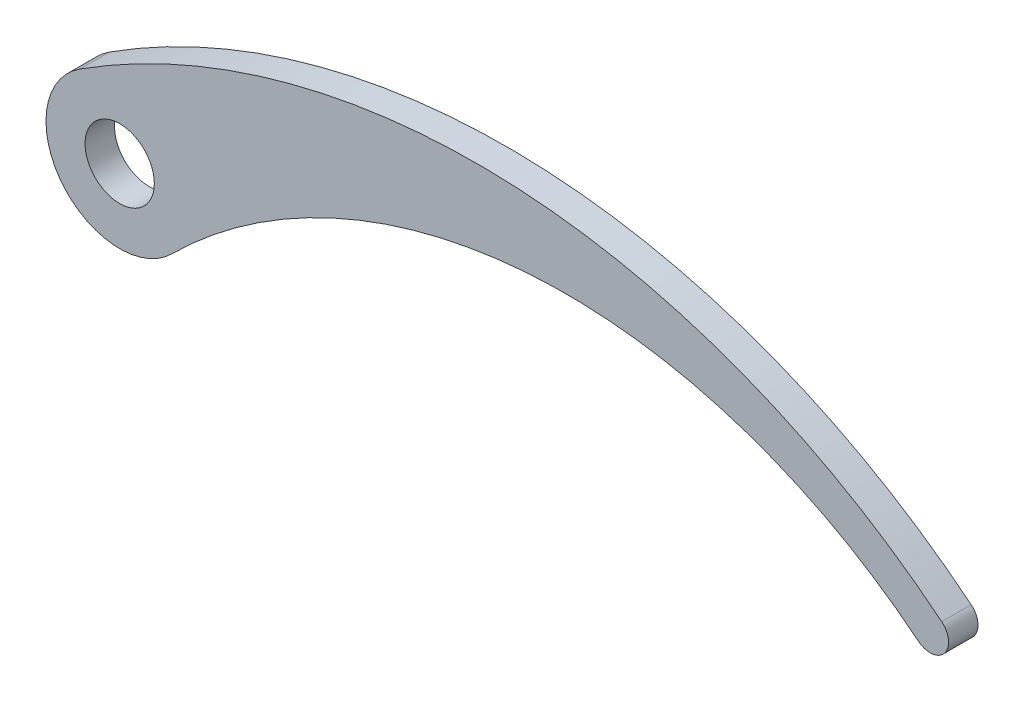
ISO-10303-21;
HEADER;
FILE_DESCRIPTION(('STEP AP214'),'2;1');
FILE_NAME('part.step','',(''),(''),'','','');
FILE_SCHEMA(('AUTOMOTIVE_DESIGN { 1 0 10303 214 1 1 1 1 }'));
ENDSEC;
DATA;
#1=APPLICATION_CONTEXT('core data for automotive mechanical design processes');
#2=APPLICATION_PROTOCOL_DEFINITION('international standard','automotive_design',2000,#1);
#3=PRODUCT_CONTEXT('',#1,'mechanical');
#4=PRODUCT('Part','Part','',(#3));
#5=PRODUCT_RELATED_PRODUCT_CATEGORY('part','',(#4));
#6=PRODUCT_DEFINITION_FORMATION('','',#4);
#7=PRODUCT_DEFINITION_CONTEXT('part definition',#1,'design');
#8=PRODUCT_DEFINITION('design','',#6,#7);
#9=PRODUCT_DEFINITION_SHAPE('','',#8);
#10=(LENGTH_UNIT() NAMED_UNIT(*) SI_UNIT(.MILLI.,.METRE.));
#11=(NAMED_UNIT(*) PLANE_ANGLE_UNIT() SI_UNIT($,.RADIAN.));
#12=(NAMED_UNIT(*) SI_UNIT($,.STERADIAN.) SOLID_ANGLE_UNIT());
#13=UNCERTAINTY_MEASURE_WITH_UNIT(LENGTH_MEASURE(1.E-05),#10,'distance_accuracy_value','');
#14=(GEOMETRIC_REPRESENTATION_CONTEXT(3) GLOBAL_UNCERTAINTY_ASSIGNED_CONTEXT((#13)) GLOBAL_UNIT_ASSIGNED_CONTEXT((#10,
#11,#12)) REPRESENTATION_CONTEXT('',''));
#15=CARTESIAN_POINT('',(0.,0.,0.));
#16=DIRECTION('',(0.,0.,1.));
#17=DIRECTION('',(1.,0.,0.));
#18=AXIS2_PLACEMENT_3D('',#15,#16,#17);
#19=CARTESIAN_POINT('',(39.6519886363636,-18.9361868437573,2.));
#20=DIRECTION('',(0.,0.,-1.));
#21=DIRECTION('',(-1.,0.,0.));
#22=AXIS2_PLACEMENT_3D('',#19,#20,#21);
#23=PLANE('',#22);
#24=CARTESIAN_POINT('',(24.3039772727273,-37.8723736875147,2.));
#25=DIRECTION('',(0.,0.,1.));
#26=DIRECTION('',(-1.,0.,0.));
#27=AXIS2_PLACEMENT_3D('',#24,#25,#26);
#28=CIRCLE('',#27,50.);
#29=CARTESIAN_POINT('',(55.7870775058275,0.971086504808066,2.));
#30=VERTEX_POINT('',#29);
#31=CARTESIAN_POINT('',(-2.70044191919192,4.20804152083496,2.));
#32=VERTEX_POINT('',#31);
#33=EDGE_CURVE('E92',#30,#32,#28,.T.);
#34=ORIENTED_EDGE('',*,*,#33,.T.);
#35=CARTESIAN_POINT('',(0.,0.,2.));
#36=DIRECTION('',(0.,0.,1.));
#37=DIRECTION('',(1.,0.,0.));
#38=AXIS2_PLACEMENT_3D('',#35,#36,#37);
#39=CIRCLE('',#38,5.);
#40=CARTESIAN_POINT('',(3.52371828752642,-3.54731016830384,2.));
#41=VERTEX_POINT('',#40);
#42=EDGE_CURVE('E87',#32,#41,#39,.T.);
#43=ORIENTED_EDGE('',*,*,#42,.T.);
#44=CARTESIAN_POINT('',(30.3039772727273,-30.506867447413,2.));
#45=DIRECTION('',(0.,0.,-1.));
#46=DIRECTION('',(-1.,0.,0.));
#47=AXIS2_PLACEMENT_3D('',#44,#45,#46);
#48=CIRCLE('',#47,38.);
#49=CARTESIAN_POINT('',(54.2135024609149,-0.971556288134171,2.));
#50=VERTEX_POINT('',#49);
#51=EDGE_CURVE('E90',#41,#50,#48,.T.);
#52=ORIENTED_EDGE('',*,*,#51,.T.);
#53=CARTESIAN_POINT('',(55.,0.,2.));
#54=DIRECTION('',(0.,0.,1.));
#55=DIRECTION('',(1.,0.,0.));
#56=AXIS2_PLACEMENT_3D('',#53,#54,#55);
#57=CIRCLE('',#56,1.25);
#58=EDGE_CURVE('E57',#50,#30,#57,.T.);
#59=ORIENTED_EDGE('',*,*,#58,.T.);
#60=EDGE_LOOP('',(#34,#43,#52,#59));
#61=FACE_BOUND('',#60,.T.);
#62=CARTESIAN_POINT('',(0.,0.,2.));
#63=DIRECTION('',(0.,0.,1.));
#64=DIRECTION('',(1.,0.,0.));
#65=AXIS2_PLACEMENT_3D('',#62,#63,#64);
#66=CIRCLE('',#65,2.35);
#67=CARTESIAN_POINT('',(2.35,0.,2.));
#68=VERTEX_POINT('',#67);
#69=EDGE_CURVE('E112',#68,#68,#66,.T.);
#70=ORIENTED_EDGE('',*,*,#69,.F.);
#71=EDGE_LOOP('',(#70));
#72=FACE_BOUND('',#71,.T.);
#73=ADVANCED_FACE('F39',(#61,#72),#23,.F.);
#74=CARTESIAN_POINT('',(39.6519886363636,-18.9361868437573,0.));
#75=DIRECTION('',(0.,0.,-1.));
#76=DIRECTION('',(-1.,0.,0.));
#77=AXIS2_PLACEMENT_3D('',#74,#75,#76);
#78=PLANE('',#77);
#79=CARTESIAN_POINT('',(24.3039772727273,-37.8723736875147,0.));
#80=DIRECTION('',(0.,0.,1.));
#81=DIRECTION('',(-1.,0.,0.));
#82=AXIS2_PLACEMENT_3D('',#79,#80,#81);
#83=CIRCLE('',#82,50.);
#84=CARTESIAN_POINT('',(55.7870775058275,0.971086504808066,0.));
#85=VERTEX_POINT('',#84);
#86=CARTESIAN_POINT('',(-2.70044191919192,4.20804152083496,0.));
#87=VERTEX_POINT('',#86);
#88=EDGE_CURVE('E108',#85,#87,#83,.T.);
#89=ORIENTED_EDGE('',*,*,#88,.F.);
#90=CARTESIAN_POINT('',(55.,0.,0.));
#91=DIRECTION('',(0.,0.,1.));
#92=DIRECTION('',(1.,0.,0.));
#93=AXIS2_PLACEMENT_3D('',#90,#91,#92);
#94=CIRCLE('',#93,1.25);
#95=CARTESIAN_POINT('',(54.2135024609149,-0.971556288134171,0.));
#96=VERTEX_POINT('',#95);
#97=EDGE_CURVE('E80',#96,#85,#94,.T.);
#98=ORIENTED_EDGE('',*,*,#97,.F.);
#99=CARTESIAN_POINT('',(30.3039772727273,-30.506867447413,0.));
#100=DIRECTION('',(0.,0.,-1.));
#101=DIRECTION('',(-1.,0.,0.));
#102=AXIS2_PLACEMENT_3D('',#99,#100,#101);
#103=CIRCLE('',#102,38.);
#104=CARTESIAN_POINT('',(3.52371828752642,-3.54731016830384,0.));
#105=VERTEX_POINT('',#104);
#106=EDGE_CURVE('E74',#105,#96,#103,.T.);
#107=ORIENTED_EDGE('',*,*,#106,.F.);
#108=CARTESIAN_POINT('',(0.,0.,0.));
#109=DIRECTION('',(0.,0.,1.));
#110=DIRECTION('',(1.,0.,0.));
#111=AXIS2_PLACEMENT_3D('',#108,#109,#110);
#112=CIRCLE('',#111,5.);
#113=EDGE_CURVE('E97',#87,#105,#112,.T.);
#114=ORIENTED_EDGE('',*,*,#113,.F.);
#115=EDGE_LOOP('',(#89,#98,#107,#114));
#116=FACE_BOUND('',#115,.T.);
#117=CARTESIAN_POINT('',(0.,0.,0.));
#118=DIRECTION('',(0.,0.,1.));
#119=DIRECTION('',(1.,0.,0.));
#120=AXIS2_PLACEMENT_3D('',#117,#118,#119);
#121=CIRCLE('',#120,2.35);
#122=CARTESIAN_POINT('',(2.35,0.,0.));
#123=VERTEX_POINT('',#122);
#124=EDGE_CURVE('E130',#123,#123,#121,.T.);
#125=ORIENTED_EDGE('',*,*,#124,.T.);
#126=EDGE_LOOP('',(#125));
#127=FACE_BOUND('',#126,.T.);
#128=ADVANCED_FACE('F125',(#116,#127),#78,.T.);
#129=CARTESIAN_POINT('',(24.3039772727273,-37.8723736875147,2.));
#130=DIRECTION('',(0.,0.,-1.));
#131=DIRECTION('',(-1.,0.,0.));
#132=AXIS2_PLACEMENT_3D('',#129,#130,#131);
#133=CYLINDRICAL_SURFACE('',#132,50.);
#134=ORIENTED_EDGE('',*,*,#88,.T.);
#135=DIRECTION('',(0.,0.,-1.));
#136=VECTOR('',#135,1.);
#137=CARTESIAN_POINT('',(-2.70044191919192,4.20804152083496,2.));
#138=LINE('',#137,#136);
#139=EDGE_CURVE('E11',#32,#87,#138,.T.);
#140=ORIENTED_EDGE('',*,*,#139,.F.);
#141=ORIENTED_EDGE('',*,*,#33,.F.);
#142=DIRECTION('',(0.,0.,-1.));
#143=VECTOR('',#142,1.);
#144=CARTESIAN_POINT('',(55.7870775058275,0.971086504808066,2.));
#145=LINE('',#144,#143);
#146=EDGE_CURVE('E104',#30,#85,#145,.T.);
#147=ORIENTED_EDGE('',*,*,#146,.T.);
#148=EDGE_LOOP('',(#134,#140,#141,#147));
#149=FACE_BOUND('',#148,.T.);
#150=ADVANCED_FACE('F41',(#149),#133,.T.);
#151=CARTESIAN_POINT('',(0.,0.,2.));
#152=DIRECTION('',(0.,0.,-1.));
#153=DIRECTION('',(-1.,0.,0.));
#154=AXIS2_PLACEMENT_3D('',#151,#152,#153);
#155=CYLINDRICAL_SURFACE('',#154,5.);
#156=ORIENTED_EDGE('',*,*,#113,.T.);
#157=DIRECTION('',(0.,0.,-1.));
#158=VECTOR('',#157,1.);
#159=CARTESIAN_POINT('',(3.52371828752642,-3.54731016830384,2.));
#160=LINE('',#159,#158);
#161=EDGE_CURVE('E49',#41,#105,#160,.T.);
#162=ORIENTED_EDGE('',*,*,#161,.F.);
#163=ORIENTED_EDGE('',*,*,#42,.F.);
#164=ORIENTED_EDGE('',*,*,#139,.T.);
#165=EDGE_LOOP('',(#156,#162,#163,#164));
#166=FACE_BOUND('',#165,.T.);
#167=ADVANCED_FACE('F96',(#166),#155,.T.);
#168=CARTESIAN_POINT('',(30.3039772727273,-30.506867447413,2.));
#169=DIRECTION('',(0.,0.,-1.));
#170=DIRECTION('',(-1.,0.,0.));
#171=AXIS2_PLACEMENT_3D('',#168,#169,#170);
#172=CYLINDRICAL_SURFACE('',#171,38.);
#173=ORIENTED_EDGE('',*,*,#106,.T.);
#174=DIRECTION('',(0.,0.,-1.));
#175=VECTOR('',#174,1.);
#176=CARTESIAN_POINT('',(54.2135024609149,-0.971556288134171,2.));
#177=LINE('',#176,#175);
#178=EDGE_CURVE('E99',#50,#96,#177,.T.);
#179=ORIENTED_EDGE('',*,*,#178,.F.);
#180=ORIENTED_EDGE('',*,*,#51,.F.);
#181=ORIENTED_EDGE('',*,*,#161,.T.);
#182=EDGE_LOOP('',(#173,#179,#180,#181));
#183=FACE_BOUND('',#182,.T.);
#184=ADVANCED_FACE('F100',(#183),#172,.F.);
#185=CARTESIAN_POINT('',(55.,0.,2.));
#186=DIRECTION('',(0.,0.,-1.));
#187=DIRECTION('',(-1.,0.,0.));
#188=AXIS2_PLACEMENT_3D('',#185,#186,#187);
#189=CYLINDRICAL_SURFACE('',#188,1.25);
#190=ORIENTED_EDGE('',*,*,#97,.T.);
#191=ORIENTED_EDGE('',*,*,#146,.F.);
#192=ORIENTED_EDGE('',*,*,#58,.F.);
#193=ORIENTED_EDGE('',*,*,#178,.T.);
#194=EDGE_LOOP('',(#190,#191,#192,#193));
#195=FACE_BOUND('',#194,.T.);
#196=ADVANCED_FACE('F122',(#195),#189,.T.);
#197=CARTESIAN_POINT('',(0.,0.,2.));
#198=DIRECTION('',(0.,0.,-1.));
#199=DIRECTION('',(-1.,0.,0.));
#200=AXIS2_PLACEMENT_3D('',#197,#198,#199);
#201=CYLINDRICAL_SURFACE('',#200,2.35);
#202=ORIENTED_EDGE('',*,*,#69,.T.);
#203=EDGE_LOOP('',(#202));
#204=FACE_BOUND('',#203,.T.);
#205=ORIENTED_EDGE('',*,*,#124,.F.);
#206=EDGE_LOOP('',(#205));
#207=FACE_BOUND('',#206,.T.);
#208=ADVANCED_FACE('F138',(#204,#207),#201,.F.);
#209=CLOSED_SHELL('',(#73,#128,#150,#167,#184,#196,#208));
#210=MANIFOLD_SOLID_BREP('B2',#209);
#211=ADVANCED_BREP_SHAPE_REPRESENTATION('',(#18,#210),#14);
#212=SHAPE_DEFINITION_REPRESENTATION(#9,#211);
ENDSEC;
END-ISO-10303-21;
